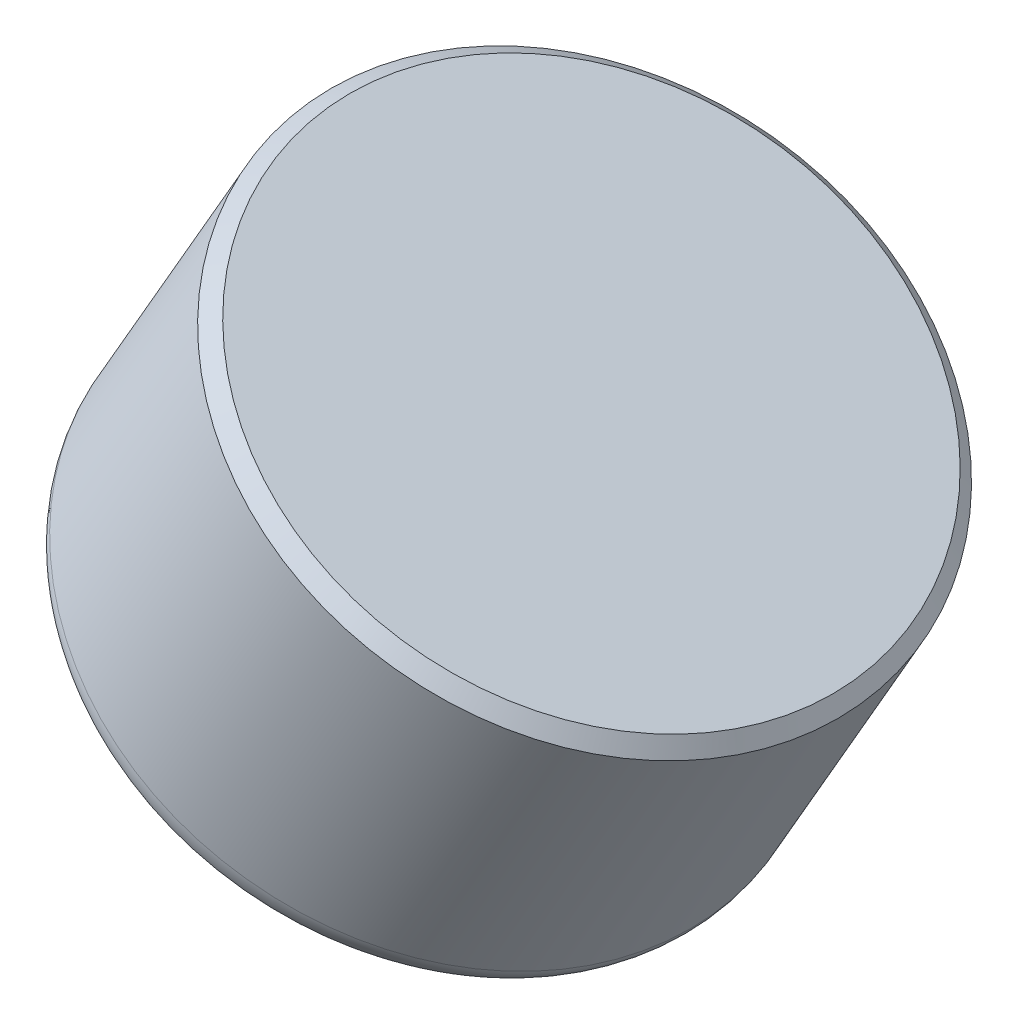
ISO-10303-21;
HEADER;
FILE_DESCRIPTION(('STEP AP214'),'2;1');
FILE_NAME('part.step','',(''),(''),'','','');
FILE_SCHEMA(('AUTOMOTIVE_DESIGN { 1 0 10303 214 1 1 1 1 }'));
ENDSEC;
DATA;
#1=APPLICATION_CONTEXT('core data for automotive mechanical design processes');
#2=APPLICATION_PROTOCOL_DEFINITION('international standard','automotive_design',2000,#1);
#3=PRODUCT_CONTEXT('',#1,'mechanical');
#4=PRODUCT('Part','Part','',(#3));
#5=PRODUCT_RELATED_PRODUCT_CATEGORY('part','',(#4));
#6=PRODUCT_DEFINITION_FORMATION('','',#4);
#7=PRODUCT_DEFINITION_CONTEXT('part definition',#1,'design');
#8=PRODUCT_DEFINITION('design','',#6,#7);
#9=PRODUCT_DEFINITION_SHAPE('','',#8);
#10=(LENGTH_UNIT() NAMED_UNIT(*) SI_UNIT(.MILLI.,.METRE.));
#11=(NAMED_UNIT(*) PLANE_ANGLE_UNIT() SI_UNIT($,.RADIAN.));
#12=(NAMED_UNIT(*) SI_UNIT($,.STERADIAN.) SOLID_ANGLE_UNIT());
#13=UNCERTAINTY_MEASURE_WITH_UNIT(LENGTH_MEASURE(1.E-05),#10,'distance_accuracy_value','');
#14=(GEOMETRIC_REPRESENTATION_CONTEXT(3) GLOBAL_UNCERTAINTY_ASSIGNED_CONTEXT((#13)) GLOBAL_UNIT_ASSIGNED_CONTEXT((#10,
#11,#12)) REPRESENTATION_CONTEXT('',''));
#15=CARTESIAN_POINT('',(0.,0.,0.));
#16=DIRECTION('',(0.,0.,1.));
#17=DIRECTION('',(1.,0.,0.));
#18=AXIS2_PLACEMENT_3D('',#15,#16,#17);
#19=CARTESIAN_POINT('',(-21.75,-37.6721050646231,52.7));
#20=DIRECTION('',(-0.5,-0.866025403784439,0.));
#21=DIRECTION('',(0.866025403784439,-0.5,0.));
#22=AXIS2_PLACEMENT_3D('',#19,#20,#21);
#23=PLANE('',#22);
#24=CARTESIAN_POINT('',(-21.75,-37.672105064623,54.));
#25=DIRECTION('',(0.5,0.866025403784439,0.));
#26=DIRECTION('',(-0.866025403784439,0.5,0.));
#27=AXIS2_PLACEMENT_3D('',#24,#25,#26);
#28=CIRCLE('',#27,1.3);
#29=CARTESIAN_POINT('',(-22.8758330249198,-37.022105064623,54.));
#30=VERTEX_POINT('',#29);
#31=EDGE_CURVE('E20',#30,#30,#28,.F.);
#32=ORIENTED_EDGE('',*,*,#31,.T.);
#33=EDGE_LOOP('',(#32));
#34=FACE_BOUND('',#33,.T.);
#35=ADVANCED_FACE('F17',(#34),#23,.T.);
#36=CARTESIAN_POINT('',(-23.5,-40.7031939778686,54.));
#37=DIRECTION('',(0.5,0.866025403784439,0.));
#38=DIRECTION('',(-0.866025403784439,0.5,0.));
#39=AXIS2_PLACEMENT_3D('',#36,#37,#38);
#40=CYLINDRICAL_SURFACE('',#39,1.3);
#41=ORIENTED_EDGE('',*,*,#31,.F.);
#42=EDGE_LOOP('',(#41));
#43=FACE_BOUND('',#42,.T.);
#44=CARTESIAN_POINT('',(-22.,-38.1051177665152,54.));
#45=DIRECTION('',(0.5,0.866025403784439,0.));
#46=DIRECTION('',(-0.866025403784439,0.5,0.));
#47=AXIS2_PLACEMENT_3D('',#44,#45,#46);
#48=CIRCLE('',#47,1.3);
#49=CARTESIAN_POINT('',(-23.1258330249198,-37.4551177665152,54.));
#50=VERTEX_POINT('',#49);
#51=EDGE_CURVE('E81',#50,#50,#48,.F.);
#52=ORIENTED_EDGE('',*,*,#51,.T.);
#53=EDGE_LOOP('',(#52));
#54=FACE_BOUND('',#53,.T.);
#55=ADVANCED_FACE('F107',(#43,#54),#40,.F.);
#56=CARTESIAN_POINT('',(-22.,-38.1051177665152,56.35));
#57=DIRECTION('',(0.5,0.866025403784439,0.));
#58=DIRECTION('',(-0.866025403784439,0.5,0.));
#59=AXIS2_PLACEMENT_3D('',#56,#57,#58);
#60=PLANE('',#59);
#61=DIRECTION('',(0.,0.,1.));
#62=VECTOR('',#61,1.);
#63=CARTESIAN_POINT('',(-23.7625,-37.0875379170685,55.175));
#64=LINE('',#63,#62);
#65=CARTESIAN_POINT('',(-23.7625,-37.0875379170685,55.175));
#66=VERTEX_POINT('',#65);
#67=CARTESIAN_POINT('',(-23.7625,-37.0875379170685,52.825));
#68=VERTEX_POINT('',#67);
#69=EDGE_CURVE('E289',#66,#68,#64,.F.);
#70=ORIENTED_EDGE('',*,*,#69,.T.);
#71=DIRECTION('',(0.75,-0.433012701892212,-0.5));
#72=VECTOR('',#71,1.);
#73=CARTESIAN_POINT('',(-23.7625,-37.0875379170685,52.825));
#74=LINE('',#73,#72);
#75=CARTESIAN_POINT('',(-22.,-38.1051177665152,51.65));
#76=VERTEX_POINT('',#75);
#77=EDGE_CURVE('E302',#68,#76,#74,.T.);
#78=ORIENTED_EDGE('',*,*,#77,.T.);
#79=DIRECTION('',(0.749999999999982,-0.433012701892246,0.5));
#80=VECTOR('',#79,1.);
#81=CARTESIAN_POINT('',(-22.,-38.1051177665152,51.65));
#82=LINE('',#81,#80);
#83=CARTESIAN_POINT('',(-20.2375,-39.122697615962,52.825));
#84=VERTEX_POINT('',#83);
#85=EDGE_CURVE('E274',#76,#84,#82,.T.);
#86=ORIENTED_EDGE('',*,*,#85,.T.);
#87=DIRECTION('',(0.,0.,1.));
#88=VECTOR('',#87,1.);
#89=CARTESIAN_POINT('',(-20.2375,-39.122697615962,52.825));
#90=LINE('',#89,#88);
#91=CARTESIAN_POINT('',(-20.2375,-39.122697615962,55.175));
#92=VERTEX_POINT('',#91);
#93=EDGE_CURVE('E86',#84,#92,#90,.T.);
#94=ORIENTED_EDGE('',*,*,#93,.T.);
#95=DIRECTION('',(-0.75,0.433012701892211,0.5));
#96=VECTOR('',#95,1.);
#97=CARTESIAN_POINT('',(-20.2375,-39.122697615962,55.175));
#98=LINE('',#97,#96);
#99=CARTESIAN_POINT('',(-22.,-38.1051177665152,56.35));
#100=VERTEX_POINT('',#99);
#101=EDGE_CURVE('E67',#92,#100,#98,.T.);
#102=ORIENTED_EDGE('',*,*,#101,.T.);
#103=DIRECTION('',(-0.749999999999988,0.433012701892238,-0.5));
#104=VECTOR('',#103,1.);
#105=CARTESIAN_POINT('',(-22.,-38.1051177665152,56.35));
#106=LINE('',#105,#104);
#107=EDGE_CURVE('E72',#100,#66,#106,.T.);
#108=ORIENTED_EDGE('',*,*,#107,.T.);
#109=EDGE_LOOP('',(#70,#78,#86,#94,#102,#108));
#110=FACE_BOUND('',#109,.T.);
#111=ORIENTED_EDGE('',*,*,#51,.F.);
#112=EDGE_LOOP('',(#111));
#113=FACE_BOUND('',#112,.T.);
#114=ADVANCED_FACE('F83',(#110,#113),#60,.F.);
#115=CARTESIAN_POINT('',(-23.5,-40.7031939778686,56.35));
#116=DIRECTION('',(-0.433012701892224,0.25,0.866025403784436));
#117=DIRECTION('',(0.894427190999913,0.,0.447213595499963));
#118=AXIS2_PLACEMENT_3D('',#115,#116,#117);
#119=PLANE('',#118);
#120=DIRECTION('',(-0.499999999999991,-0.866025403784444,0.));
#121=VECTOR('',#120,1.);
#122=CARTESIAN_POINT('',(-22.,-38.1051177665153,56.35));
#123=LINE('',#122,#121);
#124=CARTESIAN_POINT('',(-23.5,-40.7031939778686,56.35));
#125=VERTEX_POINT('',#124);
#126=EDGE_CURVE('E74',#100,#125,#123,.T.);
#127=ORIENTED_EDGE('',*,*,#126,.T.);
#128=DIRECTION('',(0.75,-0.43301270189222,0.5));
#129=VECTOR('',#128,1.);
#130=CARTESIAN_POINT('',(-25.2625,-39.6856141284219,55.175));
#131=LINE('',#130,#129);
#132=CARTESIAN_POINT('',(-25.2625,-39.6856141284219,55.175));
#133=VERTEX_POINT('',#132);
#134=EDGE_CURVE('E285',#133,#125,#131,.T.);
#135=ORIENTED_EDGE('',*,*,#134,.F.);
#136=DIRECTION('',(-0.5,-0.866025403784439,0.));
#137=VECTOR('',#136,1.);
#138=CARTESIAN_POINT('',(-25.2625,-39.6856141284219,55.175));
#139=LINE('',#138,#137);
#140=EDGE_CURVE('E77',#133,#66,#139,.F.);
#141=ORIENTED_EDGE('',*,*,#140,.T.);
#142=ORIENTED_EDGE('',*,*,#107,.F.);
#143=EDGE_LOOP('',(#127,#135,#141,#142));
#144=FACE_BOUND('',#143,.T.);
#145=ADVANCED_FACE('F73',(#144),#119,.F.);
#146=CARTESIAN_POINT('',(-21.7375,-41.7207738273154,55.175));
#147=DIRECTION('',(0.433012701892222,-0.25,0.866025403784437));
#148=DIRECTION('',(0.894427190999914,0.,-0.447213595499961));
#149=AXIS2_PLACEMENT_3D('',#146,#147,#148);
#150=PLANE('',#149);
#151=DIRECTION('',(0.5,0.866025403784439,0.));
#152=VECTOR('',#151,1.);
#153=CARTESIAN_POINT('',(-21.7375,-41.7207738273152,55.175));
#154=LINE('',#153,#152);
#155=CARTESIAN_POINT('',(-21.7375,-41.7207738273153,55.175));
#156=VERTEX_POINT('',#155);
#157=EDGE_CURVE('E88',#92,#156,#154,.F.);
#158=ORIENTED_EDGE('',*,*,#157,.T.);
#159=DIRECTION('',(0.750000000000021,-0.433012701892231,-0.499999999999959));
#160=VECTOR('',#159,1.);
#161=CARTESIAN_POINT('',(-23.5,-40.7031939778686,56.35));
#162=LINE('',#161,#160);
#163=EDGE_CURVE('E92',#125,#156,#162,.T.);
#164=ORIENTED_EDGE('',*,*,#163,.F.);
#165=ORIENTED_EDGE('',*,*,#126,.F.);
#166=ORIENTED_EDGE('',*,*,#101,.F.);
#167=EDGE_LOOP('',(#158,#164,#165,#166));
#168=FACE_BOUND('',#167,.T.);
#169=ADVANCED_FACE('F90',(#168),#150,.F.);
#170=CARTESIAN_POINT('',(-21.7375,-41.7207738273152,52.825));
#171=DIRECTION('',(0.866025403784439,-0.5,0.));
#172=DIRECTION('',(0.5,0.866025403784439,0.));
#173=AXIS2_PLACEMENT_3D('',#170,#171,#172);
#174=PLANE('',#173);
#175=DIRECTION('',(-0.500000000000013,-0.866025403784431,0.));
#176=VECTOR('',#175,1.);
#177=CARTESIAN_POINT('',(-20.2375,-39.122697615962,52.825));
#178=LINE('',#177,#176);
#179=CARTESIAN_POINT('',(-21.7375,-41.7207738273153,52.825));
#180=VERTEX_POINT('',#179);
#181=EDGE_CURVE('E270',#84,#180,#178,.T.);
#182=ORIENTED_EDGE('',*,*,#181,.T.);
#183=DIRECTION('',(0.,0.,1.));
#184=VECTOR('',#183,1.);
#185=CARTESIAN_POINT('',(-21.7375,-41.7207738273154,49.75));
#186=LINE('',#185,#184);
#187=EDGE_CURVE('E273',#156,#180,#186,.F.);
#188=ORIENTED_EDGE('',*,*,#187,.F.);
#189=ORIENTED_EDGE('',*,*,#157,.F.);
#190=ORIENTED_EDGE('',*,*,#93,.F.);
#191=EDGE_LOOP('',(#182,#188,#189,#190));
#192=FACE_BOUND('',#191,.T.);
#193=ADVANCED_FACE('F171',(#192),#174,.F.);
#194=CARTESIAN_POINT('',(-23.5,-40.7031939778686,51.65));
#195=DIRECTION('',(0.433012701892224,-0.25,-0.866025403784436));
#196=DIRECTION('',(-0.894427190999913,0.,-0.447213595499963));
#197=AXIS2_PLACEMENT_3D('',#194,#195,#196);
#198=PLANE('',#197);
#199=DIRECTION('',(-0.49999999999999,-0.866025403784444,0.));
#200=VECTOR('',#199,1.);
#201=CARTESIAN_POINT('',(-22.,-38.1051177665152,51.65));
#202=LINE('',#201,#200);
#203=CARTESIAN_POINT('',(-23.5,-40.7031939778686,51.65));
#204=VERTEX_POINT('',#203);
#205=EDGE_CURVE('E279',#76,#204,#202,.T.);
#206=ORIENTED_EDGE('',*,*,#205,.T.);
#207=DIRECTION('',(-0.75,0.433012701892216,-0.500000000000009));
#208=VECTOR('',#207,1.);
#209=CARTESIAN_POINT('',(-21.7375,-41.7207738273153,52.825));
#210=LINE('',#209,#208);
#211=EDGE_CURVE('E277',#180,#204,#210,.T.);
#212=ORIENTED_EDGE('',*,*,#211,.F.);
#213=ORIENTED_EDGE('',*,*,#181,.F.);
#214=ORIENTED_EDGE('',*,*,#85,.F.);
#215=EDGE_LOOP('',(#206,#212,#213,#214));
#216=FACE_BOUND('',#215,.T.);
#217=ADVANCED_FACE('F168',(#216),#198,.F.);
#218=CARTESIAN_POINT('',(-25.2625,-39.6856141284219,52.825));
#219=DIRECTION('',(-0.433012701892222,0.25,-0.866025403784437));
#220=DIRECTION('',(-0.894427190999914,0.,0.447213595499961));
#221=AXIS2_PLACEMENT_3D('',#218,#219,#220);
#222=PLANE('',#221);
#223=DIRECTION('',(-0.5,-0.866025403784439,0.));
#224=VECTOR('',#223,1.);
#225=CARTESIAN_POINT('',(-25.2625,-39.6856141284219,52.825));
#226=LINE('',#225,#224);
#227=CARTESIAN_POINT('',(-25.2625,-39.6856141284219,52.825));
#228=VERTEX_POINT('',#227);
#229=EDGE_CURVE('E35',#68,#228,#226,.T.);
#230=ORIENTED_EDGE('',*,*,#229,.T.);
#231=DIRECTION('',(-0.75,0.43301270189222,0.5));
#232=VECTOR('',#231,1.);
#233=CARTESIAN_POINT('',(-23.5,-40.7031939778686,51.65));
#234=LINE('',#233,#232);
#235=EDGE_CURVE('E282',#204,#228,#234,.T.);
#236=ORIENTED_EDGE('',*,*,#235,.F.);
#237=ORIENTED_EDGE('',*,*,#205,.F.);
#238=ORIENTED_EDGE('',*,*,#77,.F.);
#239=EDGE_LOOP('',(#230,#236,#237,#238));
#240=FACE_BOUND('',#239,.T.);
#241=ADVANCED_FACE('F164',(#240),#222,.F.);
#242=CARTESIAN_POINT('',(-25.2625,-39.6856141284219,55.175));
#243=DIRECTION('',(-0.866025403784439,0.5,0.));
#244=DIRECTION('',(-0.5,-0.866025403784439,0.));
#245=AXIS2_PLACEMENT_3D('',#242,#243,#244);
#246=PLANE('',#245);
#247=ORIENTED_EDGE('',*,*,#140,.F.);
#248=DIRECTION('',(0.,0.,1.));
#249=VECTOR('',#248,1.);
#250=CARTESIAN_POINT('',(-25.2625,-39.6856141284219,49.75));
#251=LINE('',#250,#249);
#252=EDGE_CURVE('E150',#228,#133,#251,.T.);
#253=ORIENTED_EDGE('',*,*,#252,.F.);
#254=ORIENTED_EDGE('',*,*,#229,.F.);
#255=ORIENTED_EDGE('',*,*,#69,.F.);
#256=EDGE_LOOP('',(#247,#253,#254,#255));
#257=FACE_BOUND('',#256,.T.);
#258=ADVANCED_FACE('F161',(#257),#246,.F.);
#259=CARTESIAN_POINT('',(-23.5,-40.7031939778686,49.75));
#260=DIRECTION('',(-0.5,-0.866025403784439,0.));
#261=DIRECTION('',(0.866025403784439,-0.5,0.));
#262=AXIS2_PLACEMENT_3D('',#259,#260,#261);
#263=PLANE('',#262);
#264=CARTESIAN_POINT('',(-23.5,-40.7031939778685,54.));
#265=DIRECTION('',(0.5,0.866025403784439,0.));
#266=DIRECTION('',(0.,0.,-1.));
#267=AXIS2_PLACEMENT_3D('',#264,#265,#266);
#268=CIRCLE('',#267,3.75);
#269=CARTESIAN_POINT('',(-23.5,-40.7031939778685,50.25));
#270=VERTEX_POINT('',#269);
#271=EDGE_CURVE('E99',#270,#270,#268,.T.);
#272=ORIENTED_EDGE('',*,*,#271,.F.);
#273=EDGE_LOOP('',(#272));
#274=FACE_BOUND('',#273,.T.);
#275=ORIENTED_EDGE('',*,*,#235,.T.);
#276=ORIENTED_EDGE('',*,*,#252,.T.);
#277=ORIENTED_EDGE('',*,*,#134,.T.);
#278=ORIENTED_EDGE('',*,*,#163,.T.);
#279=ORIENTED_EDGE('',*,*,#187,.T.);
#280=ORIENTED_EDGE('',*,*,#211,.T.);
#281=EDGE_LOOP('',(#275,#276,#277,#278,#279,#280));
#282=FACE_BOUND('',#281,.T.);
#283=ADVANCED_FACE('F152',(#274,#282),#263,.T.);
#284=CARTESIAN_POINT('',(-21.,-36.3730669589464,54.));
#285=DIRECTION('',(-0.5,-0.866025403784439,0.));
#286=DIRECTION('',(0.866025403784439,-0.5,0.));
#287=AXIS2_PLACEMENT_3D('',#284,#285,#286);
#288=PLANE('',#287);
#289=CARTESIAN_POINT('',(-20.9999999999738,-36.3730669589015,54.));
#290=DIRECTION('',(-0.5,-0.866025403784438,0.));
#291=DIRECTION('',(0.866025403784438,-0.5,0.));
#292=AXIS2_PLACEMENT_3D('',#289,#290,#291);
#293=CIRCLE('',#292,4.04999999998017);
#294=CARTESIAN_POINT('',(-17.492597114664,-38.3980669588916,54.));
#295=VERTEX_POINT('',#294);
#296=EDGE_CURVE('E97',#295,#295,#293,.T.);
#297=ORIENTED_EDGE('',*,*,#296,.F.);
#298=EDGE_LOOP('',(#297));
#299=FACE_BOUND('',#298,.T.);
#300=ADVANCED_FACE('F134',(#299),#288,.F.);
#301=CARTESIAN_POINT('',(-23.25,-40.2701812759763,54.));
#302=DIRECTION('',(-0.5,-0.866025403784439,0.));
#303=DIRECTION('',(0.,0.,1.));
#304=AXIS2_PLACEMENT_3D('',#301,#302,#303);
#305=TOROIDAL_SURFACE('',#304,3.75,0.5);
#306=CARTESIAN_POINT('',(-23.25,-40.2701812759763,54.));
#307=DIRECTION('',(-0.5,-0.866025403784439,0.));
#308=DIRECTION('',(0.866025403784439,-0.5,0.));
#309=AXIS2_PLACEMENT_3D('',#306,#307,#308);
#310=CIRCLE('',#309,4.25);
#311=CARTESIAN_POINT('',(-19.5693920339161,-42.3951812759763,54.));
#312=VERTEX_POINT('',#311);
#313=EDGE_CURVE('E26',#312,#312,#310,.F.);
#314=ORIENTED_EDGE('',*,*,#313,.F.);
#315=EDGE_LOOP('',(#314));
#316=FACE_BOUND('',#315,.T.);
#317=ORIENTED_EDGE('',*,*,#271,.T.);
#318=EDGE_LOOP('',(#317));
#319=FACE_BOUND('',#318,.T.);
#320=ADVANCED_FACE('F125',(#316,#319),#305,.T.);
#321=CARTESIAN_POINT('',(-21.0999999999653,-36.5462720396436,54.));
#322=DIRECTION('',(-0.5,-0.866025403784438,0.));
#323=DIRECTION('',(0.866025403784438,-0.5,0.));
#324=AXIS2_PLACEMENT_3D('',#321,#322,#323);
#325=CONICAL_SURFACE('',#324,4.24999999998682,0.785398163456573);
#326=CARTESIAN_POINT('',(-21.1,-36.5462720397033,54.));
#327=DIRECTION('',(-0.5,-0.866025403784439,0.));
#328=DIRECTION('',(0.866025403784439,-0.5,0.));
#329=AXIS2_PLACEMENT_3D('',#326,#327,#328);
#330=CIRCLE('',#329,4.25);
#331=CARTESIAN_POINT('',(-17.4193920338676,-38.6712720397313,54.));
#332=VERTEX_POINT('',#331);
#333=EDGE_CURVE('E11',#332,#332,#330,.T.);
#334=CARTESIAN_POINT('',(-17.4193920338676,-38.6712720397313,54.));
#335=CARTESIAN_POINT('',(-17.4201545867926,-38.6684261534726,54.));
#336=CARTESIAN_POINT('',(-17.4209171397175,-38.6655802672138,54.));
#337=CARTESIAN_POINT('',(-17.4224422455674,-38.6598884946963,54.));
#338=CARTESIAN_POINT('',(-17.4232047984924,-38.6570426084376,54.));
#339=CARTESIAN_POINT('',(-17.4247299043423,-38.6513508359201,54.));
#340=CARTESIAN_POINT('',(-17.4254924572673,-38.6485049496613,54.));
#341=CARTESIAN_POINT('',(-17.4270175631172,-38.6428131771438,54.));
#342=CARTESIAN_POINT('',(-17.4277801160422,-38.6399672908851,54.));
#343=CARTESIAN_POINT('',(-17.4293052218921,-38.6342755183676,54.));
#344=CARTESIAN_POINT('',(-17.4300677748171,-38.6314296321089,54.));
#345=CARTESIAN_POINT('',(-17.431592880667,-38.6257378595914,54.));
#346=CARTESIAN_POINT('',(-17.432355433592,-38.6228919733326,54.));
#347=CARTESIAN_POINT('',(-17.4338805394419,-38.6172002008151,54.));
#348=CARTESIAN_POINT('',(-17.4346430923668,-38.6143543145564,54.));
#349=CARTESIAN_POINT('',(-17.4361681982168,-38.6086625420389,54.));
#350=CARTESIAN_POINT('',(-17.4369307511417,-38.6058166557801,54.));
#351=CARTESIAN_POINT('',(-17.4384558569917,-38.6001248832626,54.));
#352=CARTESIAN_POINT('',(-17.4392184099166,-38.5972789970039,54.));
#353=CARTESIAN_POINT('',(-17.4407435157665,-38.5915872244864,54.));
#354=CARTESIAN_POINT('',(-17.4415060686915,-38.5887413382277,54.));
#355=CARTESIAN_POINT('',(-17.4430311745414,-38.5830495657102,54.));
#356=CARTESIAN_POINT('',(-17.4437937274664,-38.5802036794514,54.));
#357=CARTESIAN_POINT('',(-17.4453188333163,-38.5745119069339,54.));
#358=CARTESIAN_POINT('',(-17.4460813862413,-38.5716660206752,54.));
#359=CARTESIAN_POINT('',(-17.4476064920912,-38.5659742481577,54.));
#360=CARTESIAN_POINT('',(-17.4483690450162,-38.5631283618989,54.));
#361=CARTESIAN_POINT('',(-17.4498941508661,-38.5574365893814,54.));
#362=CARTESIAN_POINT('',(-17.4506567037911,-38.5545907031227,54.));
#363=CARTESIAN_POINT('',(-17.452181809641,-38.5488989306052,54.));
#364=CARTESIAN_POINT('',(-17.4529443625659,-38.5460530443464,54.));
#365=CARTESIAN_POINT('',(-17.4544694684159,-38.5403612718289,54.));
#366=CARTESIAN_POINT('',(-17.4552320213408,-38.5375153855702,54.));
#367=CARTESIAN_POINT('',(-17.4567571271908,-38.5318236130527,54.));
#368=CARTESIAN_POINT('',(-17.4575196801157,-38.528977726794,54.));
#369=CARTESIAN_POINT('',(-17.4590447859656,-38.5232859542765,54.));
#370=CARTESIAN_POINT('',(-17.4598073388906,-38.5204400680177,54.));
#371=CARTESIAN_POINT('',(-17.4613324447405,-38.5147482955002,54.));
#372=CARTESIAN_POINT('',(-17.4620949976655,-38.5119024092415,54.));
#373=CARTESIAN_POINT('',(-17.4636201035154,-38.506210636724,54.));
#374=CARTESIAN_POINT('',(-17.4643826564404,-38.5033647504652,54.));
#375=CARTESIAN_POINT('',(-17.4659077622903,-38.4976729779477,54.));
#376=CARTESIAN_POINT('',(-17.4666703152153,-38.494827091689,54.));
#377=CARTESIAN_POINT('',(-17.4681954210652,-38.4891353191715,54.));
#378=CARTESIAN_POINT('',(-17.4689579739902,-38.4862894329128,54.));
#379=CARTESIAN_POINT('',(-17.4704830798401,-38.4805976603953,54.));
#380=CARTESIAN_POINT('',(-17.471245632765,-38.4777517741365,54.));
#381=CARTESIAN_POINT('',(-17.472770738615,-38.472060001619,54.));
#382=CARTESIAN_POINT('',(-17.4735332915399,-38.4692141153603,54.));
#383=CARTESIAN_POINT('',(-17.4750583973899,-38.4635223428428,54.));
#384=CARTESIAN_POINT('',(-17.4758209503148,-38.460676456584,54.));
#385=CARTESIAN_POINT('',(-17.4773460561647,-38.4549846840665,54.));
#386=CARTESIAN_POINT('',(-17.4781086090897,-38.4521387978078,54.));
#387=CARTESIAN_POINT('',(-17.4796337149396,-38.4464470252903,54.));
#388=CARTESIAN_POINT('',(-17.4803962678646,-38.4436011390315,54.));
#389=CARTESIAN_POINT('',(-17.4819213737145,-38.437909366514,54.));
#390=CARTESIAN_POINT('',(-17.4826839266395,-38.4350634802553,54.));
#391=CARTESIAN_POINT('',(-17.4842090324894,-38.4293717077378,54.));
#392=CARTESIAN_POINT('',(-17.4849715854144,-38.4265258214791,54.));
#393=CARTESIAN_POINT('',(-17.4864966912643,-38.4208340489616,54.));
#394=CARTESIAN_POINT('',(-17.4872592441893,-38.4179881627028,54.));
#395=CARTESIAN_POINT('',(-17.4887843500392,-38.4122963901853,54.));
#396=CARTESIAN_POINT('',(-17.4895469029641,-38.4094505039266,54.));
#397=CARTESIAN_POINT('',(-17.4910720088141,-38.4037587314091,54.));
#398=CARTESIAN_POINT('',(-17.491834561739,-38.4009128451503,54.));
#399=CARTESIAN_POINT('',(-17.492597114664,-38.3980669588916,54.));
#400=B_SPLINE_CURVE_WITH_KNOTS('',3,(#334,#335,#336,#337,#338,#339,#340,#341,#342,#343,#344,
#345,#346,#347,#348,#349,#350,#351,#352,#353,#354,#355,#356,#357,#358,#359,#360,#361,#362,#363,
#364,#365,#366,#367,#368,#369,#370,#371,#372,#373,#374,#375,#376,#377,#378,#379,#380,#381,#382,
#383,#384,#385,#386,#387,#388,#389,#390,#391,#392,#393,#394,#395,#396,#397,#398,#399),
.UNSPECIFIED.,.F.,.F.,(4,2,2,2,2,2,2,2,2,2,2,2,2,2,2,2,2,2,2,2,2,2,2,2,2,2,2,2,2,2,2,2,4),(0.,
0.00883883476765552,0.0176776695353025,0.0265165043029581,0.0353553390706069,0.0441941738382557,
0.053033008605917,0.061871843373565,0.0707106781412205,0.0795495129088693,0.0883883476765172,
0.0972271824441727,0.106066017211827,0.114904851979476,0.123743686747131,0.13258252151478,
0.141421356282428,0.150260191050083,0.159099025817739,0.167937860585393,0.176776695353042,
0.185615530120691,0.194454364888346,0.203293199655994,0.212132034423656,0.220970869191305,
0.229809703958953,0.238648538726608,0.247487373494257,0.256326208261905,0.265165043029567,
0.274003877797215,0.28284271256487),.UNSPECIFIED.);
#401=EDGE_CURVE('BSEAM118',#332,#295,#400,.T.);
#402=ORIENTED_EDGE('',*,*,#333,.F.);
#403=ORIENTED_EDGE('',*,*,#296,.T.);
#404=ORIENTED_EDGE('',*,*,#401,.T.);
#405=ORIENTED_EDGE('',*,*,#401,.F.);
#406=EDGE_LOOP('',(#402,#404,#403,#405));
#407=FACE_BOUND('',#406,.T.);
#408=ADVANCED_FACE('F118',(#407),#325,.T.);
#409=CARTESIAN_POINT('',(-21.,-36.3730669589464,54.));
#410=DIRECTION('',(-0.5,-0.866025403784439,0.));
#411=DIRECTION('',(0.866025403784439,-0.5,0.));
#412=AXIS2_PLACEMENT_3D('',#409,#410,#411);
#413=CYLINDRICAL_SURFACE('',#412,4.25);
#414=ORIENTED_EDGE('',*,*,#333,.T.);
#415=EDGE_LOOP('',(#414));
#416=FACE_BOUND('',#415,.T.);
#417=ORIENTED_EDGE('',*,*,#313,.T.);
#418=EDGE_LOOP('',(#417));
#419=FACE_BOUND('',#418,.T.);
#420=ADVANCED_FACE('F116',(#416,#419),#413,.T.);
#421=CLOSED_SHELL('',(#35,#55,#114,#145,#169,#193,#217,#241,#258,#283,#300,#320,#408,#420));
#422=MANIFOLD_SOLID_BREP('B1',#421);
#423=ADVANCED_BREP_SHAPE_REPRESENTATION('',(#18,#422),#14);
#424=SHAPE_DEFINITION_REPRESENTATION(#9,#423);
ENDSEC;
END-ISO-10303-21;
